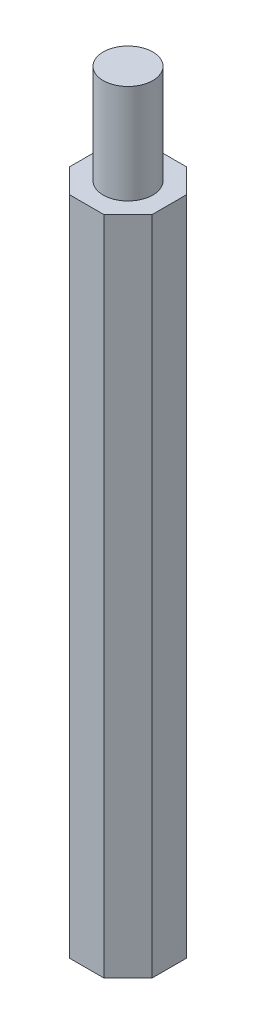
ISO-10303-21;
HEADER;
FILE_DESCRIPTION(('STEP AP214'),'2;1');
FILE_NAME('part.step','',(''),(''),'','','');
FILE_SCHEMA(('AUTOMOTIVE_DESIGN { 1 0 10303 214 1 1 1 1 }'));
ENDSEC;
DATA;
#1=APPLICATION_CONTEXT('core data for automotive mechanical design processes');
#2=APPLICATION_PROTOCOL_DEFINITION('international standard','automotive_design',2000,#1);
#3=PRODUCT_CONTEXT('',#1,'mechanical');
#4=PRODUCT('Part','Part','',(#3));
#5=PRODUCT_RELATED_PRODUCT_CATEGORY('part','',(#4));
#6=PRODUCT_DEFINITION_FORMATION('','',#4);
#7=PRODUCT_DEFINITION_CONTEXT('part definition',#1,'design');
#8=PRODUCT_DEFINITION('design','',#6,#7);
#9=PRODUCT_DEFINITION_SHAPE('','',#8);
#10=(LENGTH_UNIT() NAMED_UNIT(*) SI_UNIT(.MILLI.,.METRE.));
#11=(NAMED_UNIT(*) PLANE_ANGLE_UNIT() SI_UNIT($,.RADIAN.));
#12=(NAMED_UNIT(*) SI_UNIT($,.STERADIAN.) SOLID_ANGLE_UNIT());
#13=UNCERTAINTY_MEASURE_WITH_UNIT(LENGTH_MEASURE(1.E-05),#10,'distance_accuracy_value','');
#14=(GEOMETRIC_REPRESENTATION_CONTEXT(3) GLOBAL_UNCERTAINTY_ASSIGNED_CONTEXT((#13)) GLOBAL_UNIT_ASSIGNED_CONTEXT((#10,
#11,#12)) REPRESENTATION_CONTEXT('',''));
#15=CARTESIAN_POINT('',(0.,0.,0.));
#16=DIRECTION('',(0.,0.,1.));
#17=DIRECTION('',(1.,0.,0.));
#18=AXIS2_PLACEMENT_3D('',#15,#16,#17);
#19=CARTESIAN_POINT('',(-3.53553390593274,20.,0.));
#20=DIRECTION('',(0.,1.,0.));
#21=DIRECTION('',(0.,0.,1.));
#22=AXIS2_PLACEMENT_3D('',#19,#20,#21);
#23=PLANE('',#22);
#24=DIRECTION('',(-0.707106781186549,0.,0.707106781186547));
#25=VECTOR('',#24,1.);
#26=CARTESIAN_POINT('',(-2.5,20.,-1.03553390593274));
#27=LINE('',#26,#25);
#28=CARTESIAN_POINT('',(-1.03553390593274,20.,-2.5));
#29=VERTEX_POINT('',#28);
#30=CARTESIAN_POINT('',(-2.5,20.,-1.03553390593274));
#31=VERTEX_POINT('',#30);
#32=EDGE_CURVE('E144',#29,#31,#27,.T.);
#33=ORIENTED_EDGE('',*,*,#32,.T.);
#34=DIRECTION('',(0.,0.,1.));
#35=VECTOR('',#34,1.);
#36=CARTESIAN_POINT('',(-2.5,20.,1.03553390593274));
#37=LINE('',#36,#35);
#38=CARTESIAN_POINT('',(-2.5,20.,1.03553390593274));
#39=VERTEX_POINT('',#38);
#40=EDGE_CURVE('E92',#31,#39,#37,.T.);
#41=ORIENTED_EDGE('',*,*,#40,.T.);
#42=DIRECTION('',(0.707106781186548,0.,0.707106781186547));
#43=VECTOR('',#42,1.);
#44=CARTESIAN_POINT('',(-1.03553390593274,20.,2.5));
#45=LINE('',#44,#43);
#46=CARTESIAN_POINT('',(-1.03553390593274,20.,2.5));
#47=VERTEX_POINT('',#46);
#48=EDGE_CURVE('E159',#39,#47,#45,.T.);
#49=ORIENTED_EDGE('',*,*,#48,.T.);
#50=DIRECTION('',(1.,0.,0.));
#51=VECTOR('',#50,1.);
#52=CARTESIAN_POINT('',(1.03553390593274,20.,2.5));
#53=LINE('',#52,#51);
#54=CARTESIAN_POINT('',(1.03553390593274,20.,2.5));
#55=VERTEX_POINT('',#54);
#56=EDGE_CURVE('E171',#47,#55,#53,.T.);
#57=ORIENTED_EDGE('',*,*,#56,.T.);
#58=DIRECTION('',(0.707106781186548,0.,-0.707106781186547));
#59=VECTOR('',#58,1.);
#60=CARTESIAN_POINT('',(2.5,20.,1.03553390593274));
#61=LINE('',#60,#59);
#62=CARTESIAN_POINT('',(2.5,20.,1.03553390593274));
#63=VERTEX_POINT('',#62);
#64=EDGE_CURVE('E111',#55,#63,#61,.T.);
#65=ORIENTED_EDGE('',*,*,#64,.T.);
#66=DIRECTION('',(0.,0.,-1.));
#67=VECTOR('',#66,1.);
#68=CARTESIAN_POINT('',(2.5,20.,-1.03553390593274));
#69=LINE('',#68,#67);
#70=CARTESIAN_POINT('',(2.5,20.,-1.03553390593274));
#71=VERTEX_POINT('',#70);
#72=EDGE_CURVE('E105',#63,#71,#69,.T.);
#73=ORIENTED_EDGE('',*,*,#72,.T.);
#74=DIRECTION('',(-0.707106781186548,0.,-0.707106781186547));
#75=VECTOR('',#74,1.);
#76=CARTESIAN_POINT('',(1.03553390593274,20.,-2.5));
#77=LINE('',#76,#75);
#78=CARTESIAN_POINT('',(1.03553390593274,20.,-2.5));
#79=VERTEX_POINT('',#78);
#80=EDGE_CURVE('E109',#71,#79,#77,.T.);
#81=ORIENTED_EDGE('',*,*,#80,.T.);
#82=DIRECTION('',(-1.,0.,0.));
#83=VECTOR('',#82,1.);
#84=CARTESIAN_POINT('',(-1.03553390593274,20.,-2.5));
#85=LINE('',#84,#83);
#86=EDGE_CURVE('E49',#79,#29,#85,.T.);
#87=ORIENTED_EDGE('',*,*,#86,.T.);
#88=EDGE_LOOP('',(#33,#41,#49,#57,#65,#73,#81,#87));
#89=FACE_BOUND('',#88,.T.);
#90=CARTESIAN_POINT('',(0.,20.,0.));
#91=DIRECTION('',(0.,1.,0.));
#92=DIRECTION('',(0.,0.,1.));
#93=AXIS2_PLACEMENT_3D('',#90,#91,#92);
#94=CIRCLE('',#93,1.5);
#95=CARTESIAN_POINT('',(0.,20.,1.5));
#96=VERTEX_POINT('',#95);
#97=EDGE_CURVE('E177',#96,#96,#94,.T.);
#98=ORIENTED_EDGE('',*,*,#97,.F.);
#99=EDGE_LOOP('',(#98));
#100=FACE_BOUND('',#99,.T.);
#101=ADVANCED_FACE('F32',(#89,#100),#23,.T.);
#102=CARTESIAN_POINT('',(-2.5,20.,-1.03553390593274));
#103=DIRECTION('',(0.707106781186547,0.,0.707106781186548));
#104=DIRECTION('',(0.707106781186548,0.,-0.707106781186547));
#105=AXIS2_PLACEMENT_3D('',#102,#103,#104);
#106=PLANE('',#105);
#107=DIRECTION('',(-0.707106781186549,0.,0.707106781186547));
#108=VECTOR('',#107,1.);
#109=CARTESIAN_POINT('',(-2.5,-20.,-1.03553390593274));
#110=LINE('',#109,#108);
#111=CARTESIAN_POINT('',(-1.03553390593274,-20.,-2.5));
#112=VERTEX_POINT('',#111);
#113=CARTESIAN_POINT('',(-2.5,-20.,-1.03553390593274));
#114=VERTEX_POINT('',#113);
#115=EDGE_CURVE('E129',#112,#114,#110,.T.);
#116=ORIENTED_EDGE('',*,*,#115,.T.);
#117=DIRECTION('',(0.,-1.,0.));
#118=VECTOR('',#117,1.);
#119=CARTESIAN_POINT('',(-2.5,20.,-1.03553390593274));
#120=LINE('',#119,#118);
#121=EDGE_CURVE('E11',#31,#114,#120,.T.);
#122=ORIENTED_EDGE('',*,*,#121,.F.);
#123=ORIENTED_EDGE('',*,*,#32,.F.);
#124=DIRECTION('',(0.,-1.,0.));
#125=VECTOR('',#124,1.);
#126=CARTESIAN_POINT('',(-1.03553390593274,20.,-2.5));
#127=LINE('',#126,#125);
#128=EDGE_CURVE('E125',#29,#112,#127,.T.);
#129=ORIENTED_EDGE('',*,*,#128,.T.);
#130=EDGE_LOOP('',(#116,#122,#123,#129));
#131=FACE_BOUND('',#130,.T.);
#132=ADVANCED_FACE('F34',(#131),#106,.F.);
#133=CARTESIAN_POINT('',(-2.5,20.,1.03553390593274));
#134=DIRECTION('',(1.,0.,0.));
#135=DIRECTION('',(0.,0.,-1.));
#136=AXIS2_PLACEMENT_3D('',#133,#134,#135);
#137=PLANE('',#136);
#138=DIRECTION('',(0.,0.,1.));
#139=VECTOR('',#138,1.);
#140=CARTESIAN_POINT('',(-2.5,-20.,1.03553390593274));
#141=LINE('',#140,#139);
#142=CARTESIAN_POINT('',(-2.5,-20.,1.03553390593274));
#143=VERTEX_POINT('',#142);
#144=EDGE_CURVE('E132',#114,#143,#141,.T.);
#145=ORIENTED_EDGE('',*,*,#144,.T.);
#146=DIRECTION('',(0.,-1.,0.));
#147=VECTOR('',#146,1.);
#148=CARTESIAN_POINT('',(-2.5,20.,1.03553390593274));
#149=LINE('',#148,#147);
#150=EDGE_CURVE('E41',#39,#143,#149,.T.);
#151=ORIENTED_EDGE('',*,*,#150,.F.);
#152=ORIENTED_EDGE('',*,*,#40,.F.);
#153=ORIENTED_EDGE('',*,*,#121,.T.);
#154=EDGE_LOOP('',(#145,#151,#152,#153));
#155=FACE_BOUND('',#154,.T.);
#156=ADVANCED_FACE('F214',(#155),#137,.F.);
#157=CARTESIAN_POINT('',(-1.03553390593274,20.,2.5));
#158=DIRECTION('',(0.707106781186547,0.,-0.707106781186548));
#159=DIRECTION('',(-0.707106781186548,0.,-0.707106781186547));
#160=AXIS2_PLACEMENT_3D('',#157,#158,#159);
#161=PLANE('',#160);
#162=DIRECTION('',(0.707106781186548,0.,0.707106781186547));
#163=VECTOR('',#162,1.);
#164=CARTESIAN_POINT('',(-1.03553390593274,-20.,2.5));
#165=LINE('',#164,#163);
#166=CARTESIAN_POINT('',(-1.03553390593274,-20.,2.5));
#167=VERTEX_POINT('',#166);
#168=EDGE_CURVE('E135',#143,#167,#165,.T.);
#169=ORIENTED_EDGE('',*,*,#168,.T.);
#170=DIRECTION('',(0.,-1.,0.));
#171=VECTOR('',#170,1.);
#172=CARTESIAN_POINT('',(-1.03553390593274,20.,2.5));
#173=LINE('',#172,#171);
#174=EDGE_CURVE('E151',#47,#167,#173,.T.);
#175=ORIENTED_EDGE('',*,*,#174,.F.);
#176=ORIENTED_EDGE('',*,*,#48,.F.);
#177=ORIENTED_EDGE('',*,*,#150,.T.);
#178=EDGE_LOOP('',(#169,#175,#176,#177));
#179=FACE_BOUND('',#178,.T.);
#180=ADVANCED_FACE('F157',(#179),#161,.F.);
#181=CARTESIAN_POINT('',(1.03553390593274,20.,2.5));
#182=DIRECTION('',(0.,0.,-1.));
#183=DIRECTION('',(-1.,0.,0.));
#184=AXIS2_PLACEMENT_3D('',#181,#182,#183);
#185=PLANE('',#184);
#186=DIRECTION('',(1.,0.,0.));
#187=VECTOR('',#186,1.);
#188=CARTESIAN_POINT('',(1.03553390593274,-20.,2.5));
#189=LINE('',#188,#187);
#190=CARTESIAN_POINT('',(1.03553390593274,-20.,2.5));
#191=VERTEX_POINT('',#190);
#192=EDGE_CURVE('E137',#167,#191,#189,.T.);
#193=ORIENTED_EDGE('',*,*,#192,.T.);
#194=DIRECTION('',(0.,-1.,0.));
#195=VECTOR('',#194,1.);
#196=CARTESIAN_POINT('',(1.03553390593274,20.,2.5));
#197=LINE('',#196,#195);
#198=EDGE_CURVE('E148',#55,#191,#197,.T.);
#199=ORIENTED_EDGE('',*,*,#198,.F.);
#200=ORIENTED_EDGE('',*,*,#56,.F.);
#201=ORIENTED_EDGE('',*,*,#174,.T.);
#202=EDGE_LOOP('',(#193,#199,#200,#201));
#203=FACE_BOUND('',#202,.T.);
#204=ADVANCED_FACE('F167',(#203),#185,.F.);
#205=CARTESIAN_POINT('',(2.5,20.,1.03553390593274));
#206=DIRECTION('',(-0.707106781186547,0.,-0.707106781186548));
#207=DIRECTION('',(-0.707106781186548,0.,0.707106781186547));
#208=AXIS2_PLACEMENT_3D('',#205,#206,#207);
#209=PLANE('',#208);
#210=DIRECTION('',(0.707106781186548,0.,-0.707106781186547));
#211=VECTOR('',#210,1.);
#212=CARTESIAN_POINT('',(2.5,-20.,1.03553390593274));
#213=LINE('',#212,#211);
#214=CARTESIAN_POINT('',(2.5,-20.,1.03553390593274));
#215=VERTEX_POINT('',#214);
#216=EDGE_CURVE('E139',#191,#215,#213,.T.);
#217=ORIENTED_EDGE('',*,*,#216,.T.);
#218=DIRECTION('',(0.,-1.,0.));
#219=VECTOR('',#218,1.);
#220=CARTESIAN_POINT('',(2.5,20.,1.03553390593274));
#221=LINE('',#220,#219);
#222=EDGE_CURVE('E120',#63,#215,#221,.T.);
#223=ORIENTED_EDGE('',*,*,#222,.F.);
#224=ORIENTED_EDGE('',*,*,#64,.F.);
#225=ORIENTED_EDGE('',*,*,#198,.T.);
#226=EDGE_LOOP('',(#217,#223,#224,#225));
#227=FACE_BOUND('',#226,.T.);
#228=ADVANCED_FACE('F170',(#227),#209,.F.);
#229=CARTESIAN_POINT('',(2.5,20.,-1.03553390593274));
#230=DIRECTION('',(-1.,0.,0.));
#231=DIRECTION('',(0.,0.,1.));
#232=AXIS2_PLACEMENT_3D('',#229,#230,#231);
#233=PLANE('',#232);
#234=DIRECTION('',(0.,0.,-1.));
#235=VECTOR('',#234,1.);
#236=CARTESIAN_POINT('',(2.5,-20.,-1.03553390593274));
#237=LINE('',#236,#235);
#238=CARTESIAN_POINT('',(2.5,-20.,-1.03553390593274));
#239=VERTEX_POINT('',#238);
#240=EDGE_CURVE('E119',#215,#239,#237,.T.);
#241=ORIENTED_EDGE('',*,*,#240,.T.);
#242=DIRECTION('',(0.,-1.,0.));
#243=VECTOR('',#242,1.);
#244=CARTESIAN_POINT('',(2.5,20.,-1.03553390593274));
#245=LINE('',#244,#243);
#246=EDGE_CURVE('E116',#71,#239,#245,.T.);
#247=ORIENTED_EDGE('',*,*,#246,.F.);
#248=ORIENTED_EDGE('',*,*,#72,.F.);
#249=ORIENTED_EDGE('',*,*,#222,.T.);
#250=EDGE_LOOP('',(#241,#247,#248,#249));
#251=FACE_BOUND('',#250,.T.);
#252=ADVANCED_FACE('F117',(#251),#233,.F.);
#253=CARTESIAN_POINT('',(1.03553390593274,20.,-2.5));
#254=DIRECTION('',(-0.707106781186547,0.,0.707106781186548));
#255=DIRECTION('',(0.707106781186548,0.,0.707106781186547));
#256=AXIS2_PLACEMENT_3D('',#253,#254,#255);
#257=PLANE('',#256);
#258=DIRECTION('',(-0.707106781186548,0.,-0.707106781186547));
#259=VECTOR('',#258,1.);
#260=CARTESIAN_POINT('',(1.03553390593274,-20.,-2.5));
#261=LINE('',#260,#259);
#262=CARTESIAN_POINT('',(1.03553390593274,-20.,-2.5));
#263=VERTEX_POINT('',#262);
#264=EDGE_CURVE('E78',#239,#263,#261,.T.);
#265=ORIENTED_EDGE('',*,*,#264,.T.);
#266=DIRECTION('',(0.,-1.,0.));
#267=VECTOR('',#266,1.);
#268=CARTESIAN_POINT('',(1.03553390593274,20.,-2.5));
#269=LINE('',#268,#267);
#270=EDGE_CURVE('E121',#79,#263,#269,.T.);
#271=ORIENTED_EDGE('',*,*,#270,.F.);
#272=ORIENTED_EDGE('',*,*,#80,.F.);
#273=ORIENTED_EDGE('',*,*,#246,.T.);
#274=EDGE_LOOP('',(#265,#271,#272,#273));
#275=FACE_BOUND('',#274,.T.);
#276=ADVANCED_FACE('F123',(#275),#257,.F.);
#277=CARTESIAN_POINT('',(-1.03553390593274,20.,-2.5));
#278=DIRECTION('',(0.,0.,1.));
#279=DIRECTION('',(1.,0.,0.));
#280=AXIS2_PLACEMENT_3D('',#277,#278,#279);
#281=PLANE('',#280);
#282=DIRECTION('',(-1.,0.,0.));
#283=VECTOR('',#282,1.);
#284=CARTESIAN_POINT('',(-1.03553390593274,-20.,-2.5));
#285=LINE('',#284,#283);
#286=EDGE_CURVE('E84',#263,#112,#285,.T.);
#287=ORIENTED_EDGE('',*,*,#286,.T.);
#288=ORIENTED_EDGE('',*,*,#128,.F.);
#289=ORIENTED_EDGE('',*,*,#86,.F.);
#290=ORIENTED_EDGE('',*,*,#270,.T.);
#291=EDGE_LOOP('',(#287,#288,#289,#290));
#292=FACE_BOUND('',#291,.T.);
#293=ADVANCED_FACE('F200',(#292),#281,.F.);
#294=CARTESIAN_POINT('',(-3.53553390593274,-20.,0.));
#295=DIRECTION('',(0.,1.,0.));
#296=DIRECTION('',(0.,0.,1.));
#297=AXIS2_PLACEMENT_3D('',#294,#295,#296);
#298=PLANE('',#297);
#299=CARTESIAN_POINT('',(0.,-20.,0.));
#300=DIRECTION('',(0.,-1.,0.));
#301=DIRECTION('',(0.,0.,-1.));
#302=AXIS2_PLACEMENT_3D('',#299,#300,#301);
#303=CIRCLE('',#302,1.5);
#304=CARTESIAN_POINT('',(0.,-20.,-1.5));
#305=VERTEX_POINT('',#304);
#306=EDGE_CURVE('E183',#305,#305,#303,.T.);
#307=ORIENTED_EDGE('',*,*,#306,.F.);
#308=EDGE_LOOP('',(#307));
#309=FACE_BOUND('',#308,.T.);
#310=ORIENTED_EDGE('',*,*,#115,.F.);
#311=ORIENTED_EDGE('',*,*,#286,.F.);
#312=ORIENTED_EDGE('',*,*,#264,.F.);
#313=ORIENTED_EDGE('',*,*,#240,.F.);
#314=ORIENTED_EDGE('',*,*,#216,.F.);
#315=ORIENTED_EDGE('',*,*,#192,.F.);
#316=ORIENTED_EDGE('',*,*,#168,.F.);
#317=ORIENTED_EDGE('',*,*,#144,.F.);
#318=EDGE_LOOP('',(#310,#311,#312,#313,#314,#315,#316,#317));
#319=FACE_BOUND('',#318,.T.);
#320=ADVANCED_FACE('F163',(#309,#319),#298,.F.);
#321=CARTESIAN_POINT('',(0.,26.,0.));
#322=DIRECTION('',(0.,-1.,0.));
#323=DIRECTION('',(0.,0.,-1.));
#324=AXIS2_PLACEMENT_3D('',#321,#322,#323);
#325=CYLINDRICAL_SURFACE('',#324,1.5);
#326=CARTESIAN_POINT('',(0.,26.,0.));
#327=DIRECTION('',(0.,1.,0.));
#328=DIRECTION('',(0.,0.,1.));
#329=AXIS2_PLACEMENT_3D('',#326,#327,#328);
#330=CIRCLE('',#329,1.5);
#331=CARTESIAN_POINT('',(0.,26.,1.5));
#332=VERTEX_POINT('',#331);
#333=EDGE_CURVE('E133',#332,#332,#330,.T.);
#334=ORIENTED_EDGE('',*,*,#333,.F.);
#335=EDGE_LOOP('',(#334));
#336=FACE_BOUND('',#335,.T.);
#337=ORIENTED_EDGE('',*,*,#97,.T.);
#338=EDGE_LOOP('',(#337));
#339=FACE_BOUND('',#338,.T.);
#340=ADVANCED_FACE('F199',(#336,#339),#325,.T.);
#341=CARTESIAN_POINT('',(0.,26.,0.));
#342=DIRECTION('',(0.,1.,0.));
#343=DIRECTION('',(0.,0.,1.));
#344=AXIS2_PLACEMENT_3D('',#341,#342,#343);
#345=PLANE('',#344);
#346=ORIENTED_EDGE('',*,*,#333,.T.);
#347=EDGE_LOOP('',(#346));
#348=FACE_BOUND('',#347,.T.);
#349=ADVANCED_FACE('F194',(#348),#345,.T.);
#350=CARTESIAN_POINT('',(0.,-13.,0.));
#351=DIRECTION('',(0.,-1.,0.));
#352=DIRECTION('',(0.,0.,-1.));
#353=AXIS2_PLACEMENT_3D('',#350,#351,#352);
#354=CYLINDRICAL_SURFACE('',#353,1.5);
#355=CARTESIAN_POINT('',(0.,-13.,0.));
#356=DIRECTION('',(0.,-1.,0.));
#357=DIRECTION('',(0.,0.,-1.));
#358=AXIS2_PLACEMENT_3D('',#355,#356,#357);
#359=CIRCLE('',#358,1.5);
#360=CARTESIAN_POINT('',(0.,-13.,-1.5));
#361=VERTEX_POINT('',#360);
#362=EDGE_CURVE('E180',#361,#361,#359,.T.);
#363=ORIENTED_EDGE('',*,*,#362,.F.);
#364=EDGE_LOOP('',(#363));
#365=FACE_BOUND('',#364,.T.);
#366=ORIENTED_EDGE('',*,*,#306,.T.);
#367=EDGE_LOOP('',(#366));
#368=FACE_BOUND('',#367,.T.);
#369=ADVANCED_FACE('F191',(#365,#368),#354,.F.);
#370=CARTESIAN_POINT('',(0.,-13.,0.));
#371=DIRECTION('',(0.,-1.,0.));
#372=DIRECTION('',(0.,0.,-1.));
#373=AXIS2_PLACEMENT_3D('',#370,#371,#372);
#374=PLANE('',#373);
#375=ORIENTED_EDGE('',*,*,#362,.T.);
#376=EDGE_LOOP('',(#375));
#377=FACE_BOUND('',#376,.T.);
#378=ADVANCED_FACE('F189',(#377),#374,.T.);
#379=CLOSED_SHELL('',(#101,#132,#156,#180,#204,#228,#252,#276,#293,#320,#340,#349,#369,#378));
#380=MANIFOLD_SOLID_BREP('B2',#379);
#381=ADVANCED_BREP_SHAPE_REPRESENTATION('',(#18,#380),#14);
#382=SHAPE_DEFINITION_REPRESENTATION(#9,#381);
ENDSEC;
END-ISO-10303-21;
